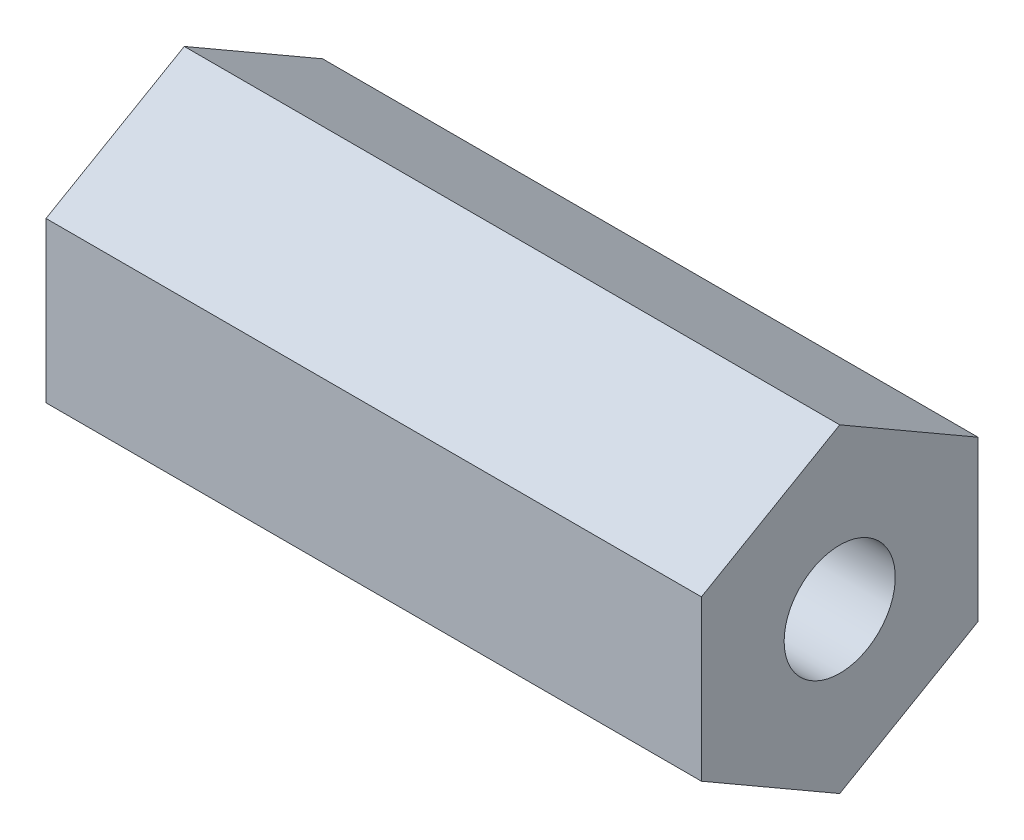
ISO-10303-21;
HEADER;
FILE_DESCRIPTION(('STEP AP214'),'2;1');
FILE_NAME('part.step','',(''),(''),'','','');
FILE_SCHEMA(('AUTOMOTIVE_DESIGN { 1 0 10303 214 1 1 1 1 }'));
ENDSEC;
DATA;
#1=APPLICATION_CONTEXT('core data for automotive mechanical design processes');
#2=APPLICATION_PROTOCOL_DEFINITION('international standard','automotive_design',2000,#1);
#3=PRODUCT_CONTEXT('',#1,'mechanical');
#4=PRODUCT('Part','Part','',(#3));
#5=PRODUCT_RELATED_PRODUCT_CATEGORY('part','',(#4));
#6=PRODUCT_DEFINITION_FORMATION('','',#4);
#7=PRODUCT_DEFINITION_CONTEXT('part definition',#1,'design');
#8=PRODUCT_DEFINITION('design','',#6,#7);
#9=PRODUCT_DEFINITION_SHAPE('','',#8);
#10=(LENGTH_UNIT() NAMED_UNIT(*) SI_UNIT(.MILLI.,.METRE.));
#11=(NAMED_UNIT(*) PLANE_ANGLE_UNIT() SI_UNIT($,.RADIAN.));
#12=(NAMED_UNIT(*) SI_UNIT($,.STERADIAN.) SOLID_ANGLE_UNIT());
#13=UNCERTAINTY_MEASURE_WITH_UNIT(LENGTH_MEASURE(1.E-05),#10,'distance_accuracy_value','');
#14=(GEOMETRIC_REPRESENTATION_CONTEXT(3) GLOBAL_UNCERTAINTY_ASSIGNED_CONTEXT((#13)) GLOBAL_UNIT_ASSIGNED_CONTEXT((#10,
#11,#12)) REPRESENTATION_CONTEXT('',''));
#15=CARTESIAN_POINT('',(0.,0.,0.));
#16=DIRECTION('',(0.,0.,1.));
#17=DIRECTION('',(1.,0.,0.));
#18=AXIS2_PLACEMENT_3D('',#15,#16,#17);
#19=CARTESIAN_POINT('',(30.099,0.,0.));
#20=DIRECTION('',(1.,0.,0.));
#21=DIRECTION('',(0.,0.,-1.));
#22=AXIS2_PLACEMENT_3D('',#19,#20,#21);
#23=PLANE('',#22);
#24=DIRECTION('',(0.,0.499999999999995,0.866025403784442));
#25=VECTOR('',#24,1.);
#26=CARTESIAN_POINT('',(30.099,3.66617420935419,-6.34999999999995));
#27=LINE('',#26,#25);
#28=CARTESIAN_POINT('',(30.099,3.66617420935419,-6.34999999999995));
#29=VERTEX_POINT('',#28);
#30=CARTESIAN_POINT('',(30.099,7.33234841870824,0.));
#31=VERTEX_POINT('',#30);
#32=EDGE_CURVE('E129',#29,#31,#27,.T.);
#33=ORIENTED_EDGE('',*,*,#32,.T.);
#34=DIRECTION('',(0.,-0.500000000000001,0.866025403784438));
#35=VECTOR('',#34,1.);
#36=CARTESIAN_POINT('',(30.099,7.33234841870824,0.));
#37=LINE('',#36,#35);
#38=CARTESIAN_POINT('',(30.099,3.6661742093541,6.35));
#39=VERTEX_POINT('',#38);
#40=EDGE_CURVE('E87',#31,#39,#37,.T.);
#41=ORIENTED_EDGE('',*,*,#40,.T.);
#42=DIRECTION('',(0.,-1.,0.));
#43=VECTOR('',#42,1.);
#44=CARTESIAN_POINT('',(30.099,3.6661742093541,6.35));
#45=LINE('',#44,#43);
#46=CARTESIAN_POINT('',(30.099,-3.66617420935415,6.34999999999998));
#47=VERTEX_POINT('',#46);
#48=EDGE_CURVE('E100',#39,#47,#45,.T.);
#49=ORIENTED_EDGE('',*,*,#48,.T.);
#50=DIRECTION('',(0.,-0.499999999999995,-0.866025403784442));
#51=VECTOR('',#50,1.);
#52=CARTESIAN_POINT('',(30.099,-3.66617420935415,6.34999999999998));
#53=LINE('',#52,#51);
#54=CARTESIAN_POINT('',(30.099,-7.33234841870824,0.));
#55=VERTEX_POINT('',#54);
#56=EDGE_CURVE('E94',#47,#55,#53,.T.);
#57=ORIENTED_EDGE('',*,*,#56,.T.);
#58=DIRECTION('',(0.,0.500000000000007,-0.866025403784435));
#59=VECTOR('',#58,1.);
#60=CARTESIAN_POINT('',(30.099,-7.33234841870824,0.));
#61=LINE('',#60,#59);
#62=CARTESIAN_POINT('',(30.099,-3.66617420935406,-6.35000000000003));
#63=VERTEX_POINT('',#62);
#64=EDGE_CURVE('E98',#55,#63,#61,.T.);
#65=ORIENTED_EDGE('',*,*,#64,.T.);
#66=DIRECTION('',(0.,1.,0.));
#67=VECTOR('',#66,1.);
#68=CARTESIAN_POINT('',(30.099,-3.66617420935406,-6.35000000000003));
#69=LINE('',#68,#67);
#70=EDGE_CURVE('E50',#63,#29,#69,.T.);
#71=ORIENTED_EDGE('',*,*,#70,.T.);
#72=EDGE_LOOP('',(#33,#41,#49,#57,#65,#71));
#73=FACE_BOUND('',#72,.T.);
#74=CARTESIAN_POINT('',(30.099,0.,0.));
#75=DIRECTION('',(1.,0.,0.));
#76=DIRECTION('',(0.,0.,-1.));
#77=AXIS2_PLACEMENT_3D('',#74,#75,#76);
#78=CIRCLE('',#77,2.5527);
#79=CARTESIAN_POINT('',(30.099,0.,2.5527));
#80=VERTEX_POINT('',#79);
#81=EDGE_CURVE('E122',#80,#80,#78,.T.);
#82=ORIENTED_EDGE('',*,*,#81,.F.);
#83=EDGE_LOOP('',(#82));
#84=FACE_BOUND('',#83,.T.);
#85=ADVANCED_FACE('F33',(#73,#84),#23,.T.);
#86=CARTESIAN_POINT('',(0.,0.,0.));
#87=DIRECTION('',(1.,0.,0.));
#88=DIRECTION('',(0.,0.,-1.));
#89=AXIS2_PLACEMENT_3D('',#86,#87,#88);
#90=PLANE('',#89);
#91=DIRECTION('',(0.,0.499999999999995,0.866025403784442));
#92=VECTOR('',#91,1.);
#93=CARTESIAN_POINT('',(0.,3.66617420935419,-6.34999999999995));
#94=LINE('',#93,#92);
#95=CARTESIAN_POINT('',(0.,3.66617420935419,-6.34999999999995));
#96=VERTEX_POINT('',#95);
#97=CARTESIAN_POINT('',(0.,7.33234841870824,0.));
#98=VERTEX_POINT('',#97);
#99=EDGE_CURVE('E118',#96,#98,#94,.T.);
#100=ORIENTED_EDGE('',*,*,#99,.F.);
#101=DIRECTION('',(0.,1.,0.));
#102=VECTOR('',#101,1.);
#103=CARTESIAN_POINT('',(0.,-3.66617420935406,-6.35000000000003));
#104=LINE('',#103,#102);
#105=CARTESIAN_POINT('',(0.,-3.66617420935406,-6.35000000000003));
#106=VERTEX_POINT('',#105);
#107=EDGE_CURVE('E79',#106,#96,#104,.T.);
#108=ORIENTED_EDGE('',*,*,#107,.F.);
#109=DIRECTION('',(0.,0.500000000000007,-0.866025403784435));
#110=VECTOR('',#109,1.);
#111=CARTESIAN_POINT('',(0.,-7.33234841870824,0.));
#112=LINE('',#111,#110);
#113=CARTESIAN_POINT('',(0.,-7.33234841870824,0.));
#114=VERTEX_POINT('',#113);
#115=EDGE_CURVE('E73',#114,#106,#112,.T.);
#116=ORIENTED_EDGE('',*,*,#115,.F.);
#117=DIRECTION('',(0.,-0.499999999999995,-0.866025403784442));
#118=VECTOR('',#117,1.);
#119=CARTESIAN_POINT('',(0.,-3.66617420935415,6.34999999999998));
#120=LINE('',#119,#118);
#121=CARTESIAN_POINT('',(0.,-3.66617420935415,6.34999999999998));
#122=VERTEX_POINT('',#121);
#123=EDGE_CURVE('E108',#122,#114,#120,.T.);
#124=ORIENTED_EDGE('',*,*,#123,.F.);
#125=DIRECTION('',(0.,-1.,0.));
#126=VECTOR('',#125,1.);
#127=CARTESIAN_POINT('',(0.,3.6661742093541,6.35));
#128=LINE('',#127,#126);
#129=CARTESIAN_POINT('',(0.,3.6661742093541,6.35));
#130=VERTEX_POINT('',#129);
#131=EDGE_CURVE('E124',#130,#122,#128,.T.);
#132=ORIENTED_EDGE('',*,*,#131,.F.);
#133=DIRECTION('',(0.,-0.500000000000001,0.866025403784438));
#134=VECTOR('',#133,1.);
#135=CARTESIAN_POINT('',(0.,7.33234841870824,0.));
#136=LINE('',#135,#134);
#137=EDGE_CURVE('E121',#98,#130,#136,.T.);
#138=ORIENTED_EDGE('',*,*,#137,.F.);
#139=EDGE_LOOP('',(#100,#108,#116,#124,#132,#138));
#140=FACE_BOUND('',#139,.T.);
#141=CARTESIAN_POINT('',(0.,0.,0.));
#142=DIRECTION('',(1.,0.,0.));
#143=DIRECTION('',(0.,0.,-1.));
#144=AXIS2_PLACEMENT_3D('',#141,#142,#143);
#145=CIRCLE('',#144,2.5527);
#146=CARTESIAN_POINT('',(0.,0.,2.5527));
#147=VERTEX_POINT('',#146);
#148=EDGE_CURVE('E222',#147,#147,#145,.T.);
#149=ORIENTED_EDGE('',*,*,#148,.T.);
#150=EDGE_LOOP('',(#149));
#151=FACE_BOUND('',#150,.T.);
#152=ADVANCED_FACE('F138',(#140,#151),#90,.F.);
#153=CARTESIAN_POINT('',(30.099,3.66617420935419,-6.34999999999995));
#154=DIRECTION('',(0.,-0.866025403784442,0.499999999999995));
#155=DIRECTION('',(0.,-0.499999999999995,-0.866025403784442));
#156=AXIS2_PLACEMENT_3D('',#153,#154,#155);
#157=PLANE('',#156);
#158=ORIENTED_EDGE('',*,*,#99,.T.);
#159=DIRECTION('',(-1.,0.,0.));
#160=VECTOR('',#159,1.);
#161=CARTESIAN_POINT('',(30.099,7.33234841870824,0.));
#162=LINE('',#161,#160);
#163=EDGE_CURVE('E11',#31,#98,#162,.T.);
#164=ORIENTED_EDGE('',*,*,#163,.F.);
#165=ORIENTED_EDGE('',*,*,#32,.F.);
#166=DIRECTION('',(-1.,0.,0.));
#167=VECTOR('',#166,1.);
#168=CARTESIAN_POINT('',(30.099,3.66617420935419,-6.34999999999995));
#169=LINE('',#168,#167);
#170=EDGE_CURVE('E114',#29,#96,#169,.T.);
#171=ORIENTED_EDGE('',*,*,#170,.T.);
#172=EDGE_LOOP('',(#158,#164,#165,#171));
#173=FACE_BOUND('',#172,.T.);
#174=ADVANCED_FACE('F35',(#173),#157,.F.);
#175=CARTESIAN_POINT('',(30.099,7.33234841870824,0.));
#176=DIRECTION('',(0.,-0.866025403784438,-0.500000000000001));
#177=DIRECTION('',(0.,0.500000000000001,-0.866025403784438));
#178=AXIS2_PLACEMENT_3D('',#175,#176,#177);
#179=PLANE('',#178);
#180=ORIENTED_EDGE('',*,*,#137,.T.);
#181=DIRECTION('',(-1.,0.,0.));
#182=VECTOR('',#181,1.);
#183=CARTESIAN_POINT('',(30.099,3.6661742093541,6.35));
#184=LINE('',#183,#182);
#185=EDGE_CURVE('E42',#39,#130,#184,.T.);
#186=ORIENTED_EDGE('',*,*,#185,.F.);
#187=ORIENTED_EDGE('',*,*,#40,.F.);
#188=ORIENTED_EDGE('',*,*,#163,.T.);
#189=EDGE_LOOP('',(#180,#186,#187,#188));
#190=FACE_BOUND('',#189,.T.);
#191=ADVANCED_FACE('F163',(#190),#179,.F.);
#192=CARTESIAN_POINT('',(30.099,3.6661742093541,6.35));
#193=DIRECTION('',(0.,0.,-1.));
#194=DIRECTION('',(0.,1.,0.));
#195=AXIS2_PLACEMENT_3D('',#192,#193,#194);
#196=PLANE('',#195);
#197=ORIENTED_EDGE('',*,*,#131,.T.);
#198=DIRECTION('',(-1.,0.,0.));
#199=VECTOR('',#198,1.);
#200=CARTESIAN_POINT('',(30.099,-3.66617420935415,6.34999999999998));
#201=LINE('',#200,#199);
#202=EDGE_CURVE('E109',#47,#122,#201,.T.);
#203=ORIENTED_EDGE('',*,*,#202,.F.);
#204=ORIENTED_EDGE('',*,*,#48,.F.);
#205=ORIENTED_EDGE('',*,*,#185,.T.);
#206=EDGE_LOOP('',(#197,#203,#204,#205));
#207=FACE_BOUND('',#206,.T.);
#208=ADVANCED_FACE('F135',(#207),#196,.F.);
#209=CARTESIAN_POINT('',(30.099,-3.66617420935415,6.34999999999998));
#210=DIRECTION('',(0.,0.866025403784442,-0.499999999999995));
#211=DIRECTION('',(0.,0.499999999999995,0.866025403784442));
#212=AXIS2_PLACEMENT_3D('',#209,#210,#211);
#213=PLANE('',#212);
#214=ORIENTED_EDGE('',*,*,#123,.T.);
#215=DIRECTION('',(-1.,0.,0.));
#216=VECTOR('',#215,1.);
#217=CARTESIAN_POINT('',(30.099,-7.33234841870824,0.));
#218=LINE('',#217,#216);
#219=EDGE_CURVE('E105',#55,#114,#218,.T.);
#220=ORIENTED_EDGE('',*,*,#219,.F.);
#221=ORIENTED_EDGE('',*,*,#56,.F.);
#222=ORIENTED_EDGE('',*,*,#202,.T.);
#223=EDGE_LOOP('',(#214,#220,#221,#222));
#224=FACE_BOUND('',#223,.T.);
#225=ADVANCED_FACE('F106',(#224),#213,.F.);
#226=CARTESIAN_POINT('',(30.099,-7.33234841870824,0.));
#227=DIRECTION('',(0.,0.866025403784435,0.500000000000007));
#228=DIRECTION('',(0.,-0.500000000000007,0.866025403784435));
#229=AXIS2_PLACEMENT_3D('',#226,#227,#228);
#230=PLANE('',#229);
#231=ORIENTED_EDGE('',*,*,#115,.T.);
#232=DIRECTION('',(-1.,0.,0.));
#233=VECTOR('',#232,1.);
#234=CARTESIAN_POINT('',(30.099,-3.66617420935406,-6.35000000000003));
#235=LINE('',#234,#233);
#236=EDGE_CURVE('E110',#63,#106,#235,.T.);
#237=ORIENTED_EDGE('',*,*,#236,.F.);
#238=ORIENTED_EDGE('',*,*,#64,.F.);
#239=ORIENTED_EDGE('',*,*,#219,.T.);
#240=EDGE_LOOP('',(#231,#237,#238,#239));
#241=FACE_BOUND('',#240,.T.);
#242=ADVANCED_FACE('F112',(#241),#230,.F.);
#243=CARTESIAN_POINT('',(30.099,-3.66617420935406,-6.35000000000003));
#244=DIRECTION('',(0.,0.,1.));
#245=DIRECTION('',(0.,-1.,0.));
#246=AXIS2_PLACEMENT_3D('',#243,#244,#245);
#247=PLANE('',#246);
#248=ORIENTED_EDGE('',*,*,#107,.T.);
#249=ORIENTED_EDGE('',*,*,#170,.F.);
#250=ORIENTED_EDGE('',*,*,#70,.F.);
#251=ORIENTED_EDGE('',*,*,#236,.T.);
#252=EDGE_LOOP('',(#248,#249,#250,#251));
#253=FACE_BOUND('',#252,.T.);
#254=ADVANCED_FACE('F143',(#253),#247,.F.);
#255=CARTESIAN_POINT('',(30.099,0.,0.));
#256=DIRECTION('',(-1.,0.,0.));
#257=DIRECTION('',(0.,0.,1.));
#258=AXIS2_PLACEMENT_3D('',#255,#256,#257);
#259=CYLINDRICAL_SURFACE('',#258,2.5527);
#260=CARTESIAN_POINT('',(30.099,0.,2.5527));
#261=CARTESIAN_POINT('',(29.78546875,0.,2.5527));
#262=CARTESIAN_POINT('',(29.4719375,0.,2.5527));
#263=CARTESIAN_POINT('',(28.844875,0.,2.5527));
#264=CARTESIAN_POINT('',(28.53134375,0.,2.5527));
#265=CARTESIAN_POINT('',(27.90428125,0.,2.5527));
#266=CARTESIAN_POINT('',(27.59075,0.,2.5527));
#267=CARTESIAN_POINT('',(26.9636875,0.,2.5527));
#268=CARTESIAN_POINT('',(26.65015625,0.,2.5527));
#269=CARTESIAN_POINT('',(26.02309375,0.,2.5527));
#270=CARTESIAN_POINT('',(25.7095625,0.,2.5527));
#271=CARTESIAN_POINT('',(25.0825,0.,2.5527));
#272=CARTESIAN_POINT('',(24.76896875,0.,2.5527));
#273=CARTESIAN_POINT('',(24.14190625,0.,2.5527));
#274=CARTESIAN_POINT('',(23.828375,0.,2.5527));
#275=CARTESIAN_POINT('',(23.2013125,0.,2.5527));
#276=CARTESIAN_POINT('',(22.88778125,0.,2.5527));
#277=CARTESIAN_POINT('',(22.26071875,0.,2.5527));
#278=CARTESIAN_POINT('',(21.9471875,0.,2.5527));
#279=CARTESIAN_POINT('',(21.320125,0.,2.5527));
#280=CARTESIAN_POINT('',(21.00659375,0.,2.5527));
#281=CARTESIAN_POINT('',(20.37953125,0.,2.5527));
#282=CARTESIAN_POINT('',(20.066,0.,2.5527));
#283=CARTESIAN_POINT('',(19.4389375,0.,2.5527));
#284=CARTESIAN_POINT('',(19.12540625,0.,2.5527));
#285=CARTESIAN_POINT('',(18.49834375,0.,2.5527));
#286=CARTESIAN_POINT('',(18.1848125,0.,2.5527));
#287=CARTESIAN_POINT('',(17.55775,0.,2.5527));
#288=CARTESIAN_POINT('',(17.24421875,0.,2.5527));
#289=CARTESIAN_POINT('',(16.61715625,0.,2.5527));
#290=CARTESIAN_POINT('',(16.303625,0.,2.5527));
#291=CARTESIAN_POINT('',(15.6765625,0.,2.5527));
#292=CARTESIAN_POINT('',(15.36303125,0.,2.5527));
#293=CARTESIAN_POINT('',(14.73596875,0.,2.5527));
#294=CARTESIAN_POINT('',(14.4224375,0.,2.5527));
#295=CARTESIAN_POINT('',(13.795375,0.,2.5527));
#296=CARTESIAN_POINT('',(13.48184375,0.,2.5527));
#297=CARTESIAN_POINT('',(12.85478125,0.,2.5527));
#298=CARTESIAN_POINT('',(12.54125,0.,2.5527));
#299=CARTESIAN_POINT('',(11.9141875,0.,2.5527));
#300=CARTESIAN_POINT('',(11.60065625,0.,2.5527));
#301=CARTESIAN_POINT('',(10.97359375,0.,2.5527));
#302=CARTESIAN_POINT('',(10.6600625,0.,2.5527));
#303=CARTESIAN_POINT('',(10.033,0.,2.5527));
#304=CARTESIAN_POINT('',(9.71946875,0.,2.5527));
#305=CARTESIAN_POINT('',(9.09240625,0.,2.5527));
#306=CARTESIAN_POINT('',(8.778875,0.,2.5527));
#307=CARTESIAN_POINT('',(8.1518125,0.,2.5527));
#308=CARTESIAN_POINT('',(7.83828125,0.,2.5527));
#309=CARTESIAN_POINT('',(7.21121875,0.,2.5527));
#310=CARTESIAN_POINT('',(6.8976875,0.,2.5527));
#311=CARTESIAN_POINT('',(6.270625,0.,2.5527));
#312=CARTESIAN_POINT('',(5.95709375,0.,2.5527));
#313=CARTESIAN_POINT('',(5.33003125,0.,2.5527));
#314=CARTESIAN_POINT('',(5.0165,0.,2.5527));
#315=CARTESIAN_POINT('',(4.3894375,0.,2.5527));
#316=CARTESIAN_POINT('',(4.07590625,0.,2.5527));
#317=CARTESIAN_POINT('',(3.44884375,0.,2.5527));
#318=CARTESIAN_POINT('',(3.1353125,0.,2.5527));
#319=CARTESIAN_POINT('',(2.50825,0.,2.5527));
#320=CARTESIAN_POINT('',(2.19471875,0.,2.5527));
#321=CARTESIAN_POINT('',(1.56765625,0.,2.5527));
#322=CARTESIAN_POINT('',(1.254125,0.,2.5527));
#323=CARTESIAN_POINT('',(0.627062499999996,0.,2.5527));
#324=CARTESIAN_POINT('',(0.313531249999997,0.,2.5527));
#325=CARTESIAN_POINT('',(0.,0.,2.5527));
#326=B_SPLINE_CURVE_WITH_KNOTS('',3,(#260,#261,#262,#263,#264,#265,#266,#267,#268,#269,#270,
#271,#272,#273,#274,#275,#276,#277,#278,#279,#280,#281,#282,#283,#284,#285,#286,#287,#288,#289,
#290,#291,#292,#293,#294,#295,#296,#297,#298,#299,#300,#301,#302,#303,#304,#305,#306,#307,#308,
#309,#310,#311,#312,#313,#314,#315,#316,#317,#318,#319,#320,#321,#322,#323,#324,#325),
.UNSPECIFIED.,.F.,.F.,(4,2,2,2,2,2,2,2,2,2,2,2,2,2,2,2,2,2,2,2,2,2,2,2,2,2,2,2,2,2,2,2,4),(0.,
0.940593750000003,1.8811875,2.82178125,3.762375,4.70296875,5.6435625,6.58415625,7.52475,
8.46534375,9.4059375,10.34653125,11.287125,12.22771875,13.1683125,14.10890625,15.0495,
15.99009375,16.9306875,17.87128125,18.811875,19.75246875,20.6930625,21.63365625,22.57425,
23.51484375,24.4554375,25.39603125,26.336625,27.27721875,28.2178125,29.15840625,30.099),.UNSPECIFIED.);
#327=EDGE_CURVE('BSEAM145',#80,#147,#326,.T.);
#328=ORIENTED_EDGE('',*,*,#81,.T.);
#329=ORIENTED_EDGE('',*,*,#148,.F.);
#330=ORIENTED_EDGE('',*,*,#327,.T.);
#331=ORIENTED_EDGE('',*,*,#327,.F.);
#332=EDGE_LOOP('',(#328,#330,#329,#331));
#333=FACE_BOUND('',#332,.T.);
#334=ADVANCED_FACE('F145',(#333),#259,.F.);
#335=CLOSED_SHELL('',(#85,#152,#174,#191,#208,#225,#242,#254,#334));
#336=MANIFOLD_SOLID_BREP('B2',#335);
#337=ADVANCED_BREP_SHAPE_REPRESENTATION('',(#18,#336),#14);
#338=SHAPE_DEFINITION_REPRESENTATION(#9,#337);
ENDSEC;
END-ISO-10303-21;
